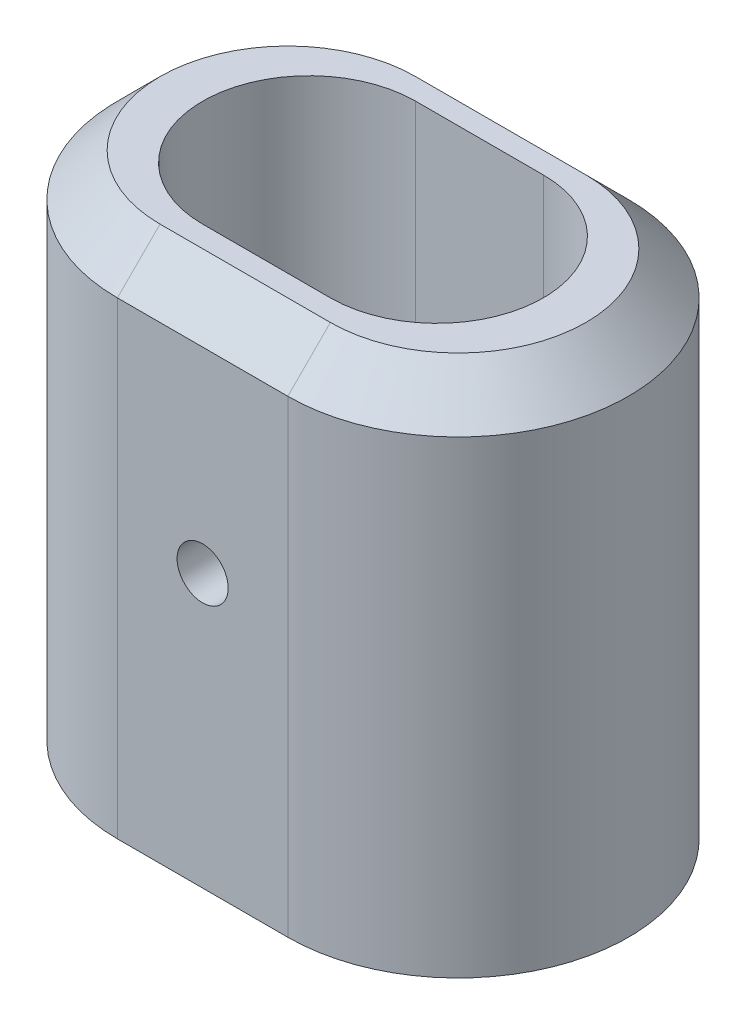
ISO-10303-21;
HEADER;
FILE_DESCRIPTION(('STEP AP214'),'2;1');
FILE_NAME('part.step','',(''),(''),'','','');
FILE_SCHEMA(('AUTOMOTIVE_DESIGN { 1 0 10303 214 1 1 1 1 }'));
ENDSEC;
DATA;
#1=APPLICATION_CONTEXT('core data for automotive mechanical design processes');
#2=APPLICATION_PROTOCOL_DEFINITION('international standard','automotive_design',2000,#1);
#3=PRODUCT_CONTEXT('',#1,'mechanical');
#4=PRODUCT('Part','Part','',(#3));
#5=PRODUCT_RELATED_PRODUCT_CATEGORY('part','',(#4));
#6=PRODUCT_DEFINITION_FORMATION('','',#4);
#7=PRODUCT_DEFINITION_CONTEXT('part definition',#1,'design');
#8=PRODUCT_DEFINITION('design','',#6,#7);
#9=PRODUCT_DEFINITION_SHAPE('','',#8);
#10=(LENGTH_UNIT() NAMED_UNIT(*) SI_UNIT(.MILLI.,.METRE.));
#11=(NAMED_UNIT(*) PLANE_ANGLE_UNIT() SI_UNIT($,.RADIAN.));
#12=(NAMED_UNIT(*) SI_UNIT($,.STERADIAN.) SOLID_ANGLE_UNIT());
#13=UNCERTAINTY_MEASURE_WITH_UNIT(LENGTH_MEASURE(1.E-05),#10,'distance_accuracy_value','');
#14=(GEOMETRIC_REPRESENTATION_CONTEXT(3) GLOBAL_UNCERTAINTY_ASSIGNED_CONTEXT((#13)) GLOBAL_UNIT_ASSIGNED_CONTEXT((#10,
#11,#12)) REPRESENTATION_CONTEXT('',''));
#15=CARTESIAN_POINT('',(0.,0.,0.));
#16=DIRECTION('',(0.,0.,1.));
#17=DIRECTION('',(1.,0.,0.));
#18=AXIS2_PLACEMENT_3D('',#15,#16,#17);
#19=CARTESIAN_POINT('',(-10.,30.,0.));
#20=DIRECTION('',(0.,-1.,0.));
#21=DIRECTION('',(0.,0.,-1.));
#22=AXIS2_PLACEMENT_3D('',#19,#20,#21);
#23=CYLINDRICAL_SURFACE('',#22,20.);
#24=DIRECTION('',(0.,-1.,0.));
#25=VECTOR('',#24,1.);
#26=CARTESIAN_POINT('',(-10.,30.,20.));
#27=LINE('',#26,#25);
#28=CARTESIAN_POINT('',(-10.,25.,20.));
#29=VERTEX_POINT('',#28);
#30=CARTESIAN_POINT('',(-10.,-30.,20.));
#31=VERTEX_POINT('',#30);
#32=EDGE_CURVE('E184',#29,#31,#27,.T.);
#33=ORIENTED_EDGE('',*,*,#32,.F.);
#34=CARTESIAN_POINT('',(-10.,25.,0.));
#35=DIRECTION('',(0.,1.,0.));
#36=DIRECTION('',(0.,0.,1.));
#37=AXIS2_PLACEMENT_3D('',#34,#35,#36);
#38=CIRCLE('',#37,20.);
#39=CARTESIAN_POINT('',(-10.,25.,-20.));
#40=VERTEX_POINT('',#39);
#41=EDGE_CURVE('E198',#29,#40,#38,.F.);
#42=ORIENTED_EDGE('',*,*,#41,.T.);
#43=DIRECTION('',(0.,-1.,0.));
#44=VECTOR('',#43,1.);
#45=CARTESIAN_POINT('',(-10.,30.,-20.));
#46=LINE('',#45,#44);
#47=CARTESIAN_POINT('',(-10.,-30.,-20.));
#48=VERTEX_POINT('',#47);
#49=EDGE_CURVE('E178',#40,#48,#46,.T.);
#50=ORIENTED_EDGE('',*,*,#49,.T.);
#51=CARTESIAN_POINT('',(-10.,-30.,0.));
#52=DIRECTION('',(0.,1.,0.));
#53=DIRECTION('',(0.,0.,1.));
#54=AXIS2_PLACEMENT_3D('',#51,#52,#53);
#55=CIRCLE('',#54,20.);
#56=EDGE_CURVE('E163',#48,#31,#55,.T.);
#57=ORIENTED_EDGE('',*,*,#56,.T.);
#58=EDGE_LOOP('',(#33,#42,#50,#57));
#59=FACE_BOUND('',#58,.T.);
#60=ADVANCED_FACE('F41',(#59),#23,.T.);
#61=CARTESIAN_POINT('',(-10.,30.,20.));
#62=DIRECTION('',(0.,0.,-1.));
#63=DIRECTION('',(-1.,0.,0.));
#64=AXIS2_PLACEMENT_3D('',#61,#62,#63);
#65=PLANE('',#64);
#66=CARTESIAN_POINT('',(0.,2.,20.));
#67=DIRECTION('',(0.,0.,1.));
#68=DIRECTION('',(1.,0.,0.));
#69=AXIS2_PLACEMENT_3D('',#66,#67,#68);
#70=CIRCLE('',#69,3.);
#71=CARTESIAN_POINT('',(3.,2.,20.));
#72=VERTEX_POINT('',#71);
#73=EDGE_CURVE('E382',#72,#72,#70,.T.);
#74=ORIENTED_EDGE('',*,*,#73,.F.);
#75=EDGE_LOOP('',(#74));
#76=FACE_BOUND('',#75,.T.);
#77=DIRECTION('',(0.,-1.,0.));
#78=VECTOR('',#77,1.);
#79=CARTESIAN_POINT('',(10.,30.,20.));
#80=LINE('',#79,#78);
#81=CARTESIAN_POINT('',(10.,25.,20.));
#82=VERTEX_POINT('',#81);
#83=CARTESIAN_POINT('',(10.,-30.,20.));
#84=VERTEX_POINT('',#83);
#85=EDGE_CURVE('E182',#82,#84,#80,.T.);
#86=ORIENTED_EDGE('',*,*,#85,.F.);
#87=DIRECTION('',(-1.,0.,0.));
#88=VECTOR('',#87,1.);
#89=CARTESIAN_POINT('',(-10.,25.,20.));
#90=LINE('',#89,#88);
#91=EDGE_CURVE('E11',#82,#29,#90,.T.);
#92=ORIENTED_EDGE('',*,*,#91,.T.);
#93=ORIENTED_EDGE('',*,*,#32,.T.);
#94=DIRECTION('',(1.,0.,0.));
#95=VECTOR('',#94,1.);
#96=CARTESIAN_POINT('',(-10.,-30.,20.));
#97=LINE('',#96,#95);
#98=EDGE_CURVE('E169',#31,#84,#97,.T.);
#99=ORIENTED_EDGE('',*,*,#98,.T.);
#100=EDGE_LOOP('',(#86,#92,#93,#99));
#101=FACE_BOUND('',#100,.T.);
#102=ADVANCED_FACE('F256',(#76,#101),#65,.F.);
#103=CARTESIAN_POINT('',(10.,30.,0.));
#104=DIRECTION('',(0.,-1.,0.));
#105=DIRECTION('',(0.,0.,-1.));
#106=AXIS2_PLACEMENT_3D('',#103,#104,#105);
#107=CYLINDRICAL_SURFACE('',#106,20.);
#108=DIRECTION('',(0.,-1.,0.));
#109=VECTOR('',#108,1.);
#110=CARTESIAN_POINT('',(9.99999999999999,30.,-20.));
#111=LINE('',#110,#109);
#112=CARTESIAN_POINT('',(9.99999999999999,25.,-20.));
#113=VERTEX_POINT('',#112);
#114=CARTESIAN_POINT('',(9.99999999999999,-30.,-20.));
#115=VERTEX_POINT('',#114);
#116=EDGE_CURVE('E180',#113,#115,#111,.T.);
#117=ORIENTED_EDGE('',*,*,#116,.F.);
#118=CARTESIAN_POINT('',(10.,25.,0.));
#119=DIRECTION('',(0.,1.,0.));
#120=DIRECTION('',(0.,0.,1.));
#121=AXIS2_PLACEMENT_3D('',#118,#119,#120);
#122=CIRCLE('',#121,20.);
#123=EDGE_CURVE('E51',#113,#82,#122,.F.);
#124=ORIENTED_EDGE('',*,*,#123,.T.);
#125=ORIENTED_EDGE('',*,*,#85,.T.);
#126=CARTESIAN_POINT('',(10.,-30.,0.));
#127=DIRECTION('',(0.,1.,0.));
#128=DIRECTION('',(0.,0.,1.));
#129=AXIS2_PLACEMENT_3D('',#126,#127,#128);
#130=CIRCLE('',#129,20.);
#131=EDGE_CURVE('E172',#84,#115,#130,.T.);
#132=ORIENTED_EDGE('',*,*,#131,.T.);
#133=EDGE_LOOP('',(#117,#124,#125,#132));
#134=FACE_BOUND('',#133,.T.);
#135=ADVANCED_FACE('F262',(#134),#107,.T.);
#136=CARTESIAN_POINT('',(-10.,30.,-20.));
#137=DIRECTION('',(0.,0.,1.));
#138=DIRECTION('',(1.,0.,0.));
#139=AXIS2_PLACEMENT_3D('',#136,#137,#138);
#140=PLANE('',#139);
#141=CARTESIAN_POINT('',(0.,2.,-20.));
#142=DIRECTION('',(0.,0.,1.));
#143=DIRECTION('',(1.,0.,0.));
#144=AXIS2_PLACEMENT_3D('',#141,#142,#143);
#145=CIRCLE('',#144,3.);
#146=CARTESIAN_POINT('',(3.,2.,-20.));
#147=VERTEX_POINT('',#146);
#148=EDGE_CURVE('E379',#147,#147,#145,.T.);
#149=ORIENTED_EDGE('',*,*,#148,.T.);
#150=EDGE_LOOP('',(#149));
#151=FACE_BOUND('',#150,.T.);
#152=ORIENTED_EDGE('',*,*,#49,.F.);
#153=DIRECTION('',(1.,0.,0.));
#154=VECTOR('',#153,1.);
#155=CARTESIAN_POINT('',(9.99999999999999,25.,-20.));
#156=LINE('',#155,#154);
#157=EDGE_CURVE('E195',#40,#113,#156,.T.);
#158=ORIENTED_EDGE('',*,*,#157,.T.);
#159=ORIENTED_EDGE('',*,*,#116,.T.);
#160=DIRECTION('',(-1.,0.,0.));
#161=VECTOR('',#160,1.);
#162=CARTESIAN_POINT('',(-10.,-30.,-20.));
#163=LINE('',#162,#161);
#164=EDGE_CURVE('E175',#115,#48,#163,.T.);
#165=ORIENTED_EDGE('',*,*,#164,.T.);
#166=EDGE_LOOP('',(#152,#158,#159,#165));
#167=FACE_BOUND('',#166,.T.);
#168=ADVANCED_FACE('F225',(#151,#167),#140,.F.);
#169=CARTESIAN_POINT('',(-10.,30.,0.));
#170=DIRECTION('',(0.,1.,0.));
#171=DIRECTION('',(0.,0.,1.));
#172=AXIS2_PLACEMENT_3D('',#169,#170,#171);
#173=PLANE('',#172);
#174=CARTESIAN_POINT('',(10.,30.,0.));
#175=DIRECTION('',(0.,1.,0.));
#176=DIRECTION('',(0.,0.,1.));
#177=AXIS2_PLACEMENT_3D('',#174,#175,#176);
#178=CIRCLE('',#177,15.);
#179=CARTESIAN_POINT('',(10.,30.,15.));
#180=VERTEX_POINT('',#179);
#181=CARTESIAN_POINT('',(10.,30.,-15.));
#182=VERTEX_POINT('',#181);
#183=EDGE_CURVE('E188',#180,#182,#178,.T.);
#184=ORIENTED_EDGE('',*,*,#183,.T.);
#185=DIRECTION('',(-1.,0.,0.));
#186=VECTOR('',#185,1.);
#187=CARTESIAN_POINT('',(-10.,30.,-15.));
#188=LINE('',#187,#186);
#189=CARTESIAN_POINT('',(-10.,30.,-15.));
#190=VERTEX_POINT('',#189);
#191=EDGE_CURVE('E192',#182,#190,#188,.T.);
#192=ORIENTED_EDGE('',*,*,#191,.T.);
#193=CARTESIAN_POINT('',(-10.,30.,0.));
#194=DIRECTION('',(0.,1.,0.));
#195=DIRECTION('',(0.,0.,1.));
#196=AXIS2_PLACEMENT_3D('',#193,#194,#195);
#197=CIRCLE('',#196,15.);
#198=CARTESIAN_POINT('',(-10.,30.,15.));
#199=VERTEX_POINT('',#198);
#200=EDGE_CURVE('E190',#190,#199,#197,.T.);
#201=ORIENTED_EDGE('',*,*,#200,.T.);
#202=DIRECTION('',(1.,0.,0.));
#203=VECTOR('',#202,1.);
#204=CARTESIAN_POINT('',(10.,30.,15.));
#205=LINE('',#204,#203);
#206=EDGE_CURVE('E186',#199,#180,#205,.T.);
#207=ORIENTED_EDGE('',*,*,#206,.T.);
#208=EDGE_LOOP('',(#184,#192,#201,#207));
#209=FACE_BOUND('',#208,.T.);
#210=CARTESIAN_POINT('',(-7.5,30.,0.));
#211=DIRECTION('',(0.,1.,0.));
#212=DIRECTION('',(0.,0.,1.));
#213=AXIS2_PLACEMENT_3D('',#210,#211,#212);
#214=CIRCLE('',#213,12.5);
#215=CARTESIAN_POINT('',(-7.5,30.,-12.5));
#216=VERTEX_POINT('',#215);
#217=CARTESIAN_POINT('',(-7.5,30.,12.5));
#218=VERTEX_POINT('',#217);
#219=EDGE_CURVE('E126',#216,#218,#214,.T.);
#220=ORIENTED_EDGE('',*,*,#219,.F.);
#221=DIRECTION('',(-1.,0.,0.));
#222=VECTOR('',#221,1.);
#223=CARTESIAN_POINT('',(-7.5,30.,-12.5));
#224=LINE('',#223,#222);
#225=CARTESIAN_POINT('',(7.5,30.,-12.5));
#226=VERTEX_POINT('',#225);
#227=EDGE_CURVE('E144',#226,#216,#224,.T.);
#228=ORIENTED_EDGE('',*,*,#227,.F.);
#229=CARTESIAN_POINT('',(7.5,30.,0.));
#230=DIRECTION('',(0.,1.,0.));
#231=DIRECTION('',(0.,0.,1.));
#232=AXIS2_PLACEMENT_3D('',#229,#230,#231);
#233=CIRCLE('',#232,12.5);
#234=CARTESIAN_POINT('',(7.50000000000001,30.,12.5));
#235=VERTEX_POINT('',#234);
#236=EDGE_CURVE('E147',#235,#226,#233,.T.);
#237=ORIENTED_EDGE('',*,*,#236,.F.);
#238=DIRECTION('',(1.,0.,0.));
#239=VECTOR('',#238,1.);
#240=CARTESIAN_POINT('',(-7.5,30.,12.5));
#241=LINE('',#240,#239);
#242=EDGE_CURVE('E156',#218,#235,#241,.T.);
#243=ORIENTED_EDGE('',*,*,#242,.F.);
#244=EDGE_LOOP('',(#220,#228,#237,#243));
#245=FACE_BOUND('',#244,.T.);
#246=ADVANCED_FACE('F232',(#209,#245),#173,.T.);
#247=CARTESIAN_POINT('',(-10.,-30.,0.));
#248=DIRECTION('',(0.,1.,0.));
#249=DIRECTION('',(0.,0.,1.));
#250=AXIS2_PLACEMENT_3D('',#247,#248,#249);
#251=PLANE('',#250);
#252=DIRECTION('',(-1.,0.,0.));
#253=VECTOR('',#252,1.);
#254=CARTESIAN_POINT('',(-7.5,-30.,-12.5));
#255=LINE('',#254,#253);
#256=CARTESIAN_POINT('',(7.5,-30.,-12.5));
#257=VERTEX_POINT('',#256);
#258=CARTESIAN_POINT('',(-7.5,-30.,-12.5));
#259=VERTEX_POINT('',#258);
#260=EDGE_CURVE('E131',#257,#259,#255,.T.);
#261=ORIENTED_EDGE('',*,*,#260,.T.);
#262=CARTESIAN_POINT('',(-7.5,-30.,0.));
#263=DIRECTION('',(0.,1.,0.));
#264=DIRECTION('',(0.,0.,1.));
#265=AXIS2_PLACEMENT_3D('',#262,#263,#264);
#266=CIRCLE('',#265,12.5);
#267=CARTESIAN_POINT('',(-7.5,-30.,12.5));
#268=VERTEX_POINT('',#267);
#269=EDGE_CURVE('E123',#259,#268,#266,.T.);
#270=ORIENTED_EDGE('',*,*,#269,.T.);
#271=DIRECTION('',(1.,0.,0.));
#272=VECTOR('',#271,1.);
#273=CARTESIAN_POINT('',(-7.5,-30.,12.5));
#274=LINE('',#273,#272);
#275=CARTESIAN_POINT('',(7.5,-30.,12.5));
#276=VERTEX_POINT('',#275);
#277=EDGE_CURVE('E135',#268,#276,#274,.T.);
#278=ORIENTED_EDGE('',*,*,#277,.T.);
#279=CARTESIAN_POINT('',(7.5,-30.,0.));
#280=DIRECTION('',(0.,1.,0.));
#281=DIRECTION('',(0.,0.,1.));
#282=AXIS2_PLACEMENT_3D('',#279,#280,#281);
#283=CIRCLE('',#282,12.5);
#284=EDGE_CURVE('E139',#276,#257,#283,.T.);
#285=ORIENTED_EDGE('',*,*,#284,.T.);
#286=EDGE_LOOP('',(#261,#270,#278,#285));
#287=FACE_BOUND('',#286,.T.);
#288=ORIENTED_EDGE('',*,*,#56,.F.);
#289=ORIENTED_EDGE('',*,*,#164,.F.);
#290=ORIENTED_EDGE('',*,*,#131,.F.);
#291=ORIENTED_EDGE('',*,*,#98,.F.);
#292=EDGE_LOOP('',(#288,#289,#290,#291));
#293=FACE_BOUND('',#292,.T.);
#294=ADVANCED_FACE('F141',(#287,#293),#251,.F.);
#295=CARTESIAN_POINT('',(-7.5,-30.,0.));
#296=DIRECTION('',(0.,1.,0.));
#297=DIRECTION('',(0.,0.,1.));
#298=AXIS2_PLACEMENT_3D('',#295,#296,#297);
#299=CYLINDRICAL_SURFACE('',#298,12.5);
#300=ORIENTED_EDGE('',*,*,#219,.T.);
#301=DIRECTION('',(0.,1.,0.));
#302=VECTOR('',#301,1.);
#303=CARTESIAN_POINT('',(-7.5,-30.,12.5));
#304=LINE('',#303,#302);
#305=EDGE_CURVE('E119',#268,#218,#304,.T.);
#306=ORIENTED_EDGE('',*,*,#305,.F.);
#307=ORIENTED_EDGE('',*,*,#269,.F.);
#308=DIRECTION('',(0.,1.,0.));
#309=VECTOR('',#308,1.);
#310=CARTESIAN_POINT('',(-7.5,-30.,-12.5));
#311=LINE('',#310,#309);
#312=EDGE_CURVE('E161',#259,#216,#311,.T.);
#313=ORIENTED_EDGE('',*,*,#312,.T.);
#314=EDGE_LOOP('',(#300,#306,#307,#313));
#315=FACE_BOUND('',#314,.T.);
#316=ADVANCED_FACE('F121',(#315),#299,.F.);
#317=CARTESIAN_POINT('',(-7.5,-30.,-12.5));
#318=DIRECTION('',(0.,0.,-1.));
#319=DIRECTION('',(-1.,0.,0.));
#320=AXIS2_PLACEMENT_3D('',#317,#318,#319);
#321=PLANE('',#320);
#322=CARTESIAN_POINT('',(0.,2.,-12.5));
#323=DIRECTION('',(0.,0.,-1.));
#324=DIRECTION('',(-1.,0.,0.));
#325=AXIS2_PLACEMENT_3D('',#322,#323,#324);
#326=CIRCLE('',#325,3.);
#327=CARTESIAN_POINT('',(-3.,2.,-12.5));
#328=VERTEX_POINT('',#327);
#329=EDGE_CURVE('E150',#328,#328,#326,.T.);
#330=ORIENTED_EDGE('',*,*,#329,.T.);
#331=EDGE_LOOP('',(#330));
#332=FACE_BOUND('',#331,.T.);
#333=ORIENTED_EDGE('',*,*,#227,.T.);
#334=ORIENTED_EDGE('',*,*,#312,.F.);
#335=ORIENTED_EDGE('',*,*,#260,.F.);
#336=DIRECTION('',(0.,1.,0.));
#337=VECTOR('',#336,1.);
#338=CARTESIAN_POINT('',(7.5,-30.,-12.5));
#339=LINE('',#338,#337);
#340=EDGE_CURVE('E164',#257,#226,#339,.T.);
#341=ORIENTED_EDGE('',*,*,#340,.T.);
#342=EDGE_LOOP('',(#333,#334,#335,#341));
#343=FACE_BOUND('',#342,.T.);
#344=ADVANCED_FACE('F241',(#332,#343),#321,.F.);
#345=CARTESIAN_POINT('',(7.5,-30.,0.));
#346=DIRECTION('',(0.,1.,0.));
#347=DIRECTION('',(0.,0.,1.));
#348=AXIS2_PLACEMENT_3D('',#345,#346,#347);
#349=CYLINDRICAL_SURFACE('',#348,12.5);
#350=ORIENTED_EDGE('',*,*,#236,.T.);
#351=ORIENTED_EDGE('',*,*,#340,.F.);
#352=ORIENTED_EDGE('',*,*,#284,.F.);
#353=DIRECTION('',(0.,1.,0.));
#354=VECTOR('',#353,1.);
#355=CARTESIAN_POINT('',(7.50000000000001,-30.,12.5));
#356=LINE('',#355,#354);
#357=EDGE_CURVE('E130',#276,#235,#356,.T.);
#358=ORIENTED_EDGE('',*,*,#357,.T.);
#359=EDGE_LOOP('',(#350,#351,#352,#358));
#360=FACE_BOUND('',#359,.T.);
#361=ADVANCED_FACE('F239',(#360),#349,.F.);
#362=CARTESIAN_POINT('',(-7.5,-30.,12.5));
#363=DIRECTION('',(0.,0.,1.));
#364=DIRECTION('',(1.,0.,0.));
#365=AXIS2_PLACEMENT_3D('',#362,#363,#364);
#366=PLANE('',#365);
#367=CARTESIAN_POINT('',(0.,2.,12.5));
#368=DIRECTION('',(0.,0.,1.));
#369=DIRECTION('',(1.,0.,0.));
#370=AXIS2_PLACEMENT_3D('',#367,#368,#369);
#371=CIRCLE('',#370,3.);
#372=CARTESIAN_POINT('',(3.,2.,12.5));
#373=VERTEX_POINT('',#372);
#374=EDGE_CURVE('E46',#373,#373,#371,.T.);
#375=ORIENTED_EDGE('',*,*,#374,.T.);
#376=EDGE_LOOP('',(#375));
#377=FACE_BOUND('',#376,.T.);
#378=ORIENTED_EDGE('',*,*,#242,.T.);
#379=ORIENTED_EDGE('',*,*,#357,.F.);
#380=ORIENTED_EDGE('',*,*,#277,.F.);
#381=ORIENTED_EDGE('',*,*,#305,.T.);
#382=EDGE_LOOP('',(#378,#379,#380,#381));
#383=FACE_BOUND('',#382,.T.);
#384=ADVANCED_FACE('F136',(#377,#383),#366,.F.);
#385=CARTESIAN_POINT('',(-10.,30.,15.));
#386=DIRECTION('',(0.,0.707106781186545,0.70710678118655));
#387=DIRECTION('',(-1.,0.,0.));
#388=AXIS2_PLACEMENT_3D('',#385,#386,#387);
#389=PLANE('',#388);
#390=DIRECTION('',(0.,0.70710678118655,-0.707106781186545));
#391=VECTOR('',#390,1.);
#392=CARTESIAN_POINT('',(-10.,25.,20.));
#393=LINE('',#392,#391);
#394=EDGE_CURVE('E205',#29,#199,#393,.T.);
#395=ORIENTED_EDGE('',*,*,#394,.F.);
#396=ORIENTED_EDGE('',*,*,#91,.F.);
#397=DIRECTION('',(0.,-0.70710678118655,0.707106781186545));
#398=VECTOR('',#397,1.);
#399=CARTESIAN_POINT('',(10.,30.,15.));
#400=LINE('',#399,#398);
#401=EDGE_CURVE('E157',#180,#82,#400,.T.);
#402=ORIENTED_EDGE('',*,*,#401,.F.);
#403=ORIENTED_EDGE('',*,*,#206,.F.);
#404=EDGE_LOOP('',(#395,#396,#402,#403));
#405=FACE_BOUND('',#404,.T.);
#406=ADVANCED_FACE('F44',(#405),#389,.T.);
#407=CARTESIAN_POINT('',(10.,30.,0.));
#408=DIRECTION('',(0.,-1.,0.));
#409=DIRECTION('',(0.,0.,-1.));
#410=AXIS2_PLACEMENT_3D('',#407,#408,#409);
#411=CONICAL_SURFACE('',#410,15.,0.785398163397446);
#412=ORIENTED_EDGE('',*,*,#401,.T.);
#413=ORIENTED_EDGE('',*,*,#123,.F.);
#414=DIRECTION('',(0.,-0.707106781186549,-0.707106781186545));
#415=VECTOR('',#414,1.);
#416=CARTESIAN_POINT('',(10.,30.,-15.));
#417=LINE('',#416,#415);
#418=EDGE_CURVE('E203',#182,#113,#417,.T.);
#419=ORIENTED_EDGE('',*,*,#418,.F.);
#420=ORIENTED_EDGE('',*,*,#183,.F.);
#421=EDGE_LOOP('',(#412,#413,#419,#420));
#422=FACE_BOUND('',#421,.T.);
#423=ADVANCED_FACE('F211',(#422),#411,.T.);
#424=CARTESIAN_POINT('',(-10.,30.,0.));
#425=DIRECTION('',(0.,-1.,0.));
#426=DIRECTION('',(0.,0.,-1.));
#427=AXIS2_PLACEMENT_3D('',#424,#425,#426);
#428=CONICAL_SURFACE('',#427,15.,0.785398163397446);
#429=ORIENTED_EDGE('',*,*,#394,.T.);
#430=ORIENTED_EDGE('',*,*,#200,.F.);
#431=DIRECTION('',(0.,0.707106781186549,0.707106781186545));
#432=VECTOR('',#431,1.);
#433=CARTESIAN_POINT('',(-10.,25.,-20.));
#434=LINE('',#433,#432);
#435=EDGE_CURVE('E201',#40,#190,#434,.T.);
#436=ORIENTED_EDGE('',*,*,#435,.F.);
#437=ORIENTED_EDGE('',*,*,#41,.F.);
#438=EDGE_LOOP('',(#429,#430,#436,#437));
#439=FACE_BOUND('',#438,.T.);
#440=ADVANCED_FACE('F220',(#439),#428,.T.);
#441=CARTESIAN_POINT('',(-10.,30.,-15.));
#442=DIRECTION('',(0.,0.707106781186545,-0.70710678118655));
#443=DIRECTION('',(1.,0.,0.));
#444=AXIS2_PLACEMENT_3D('',#441,#442,#443);
#445=PLANE('',#444);
#446=ORIENTED_EDGE('',*,*,#418,.T.);
#447=ORIENTED_EDGE('',*,*,#157,.F.);
#448=ORIENTED_EDGE('',*,*,#435,.T.);
#449=ORIENTED_EDGE('',*,*,#191,.F.);
#450=EDGE_LOOP('',(#446,#447,#448,#449));
#451=FACE_BOUND('',#450,.T.);
#452=ADVANCED_FACE('F229',(#451),#445,.T.);
#453=CARTESIAN_POINT('',(0.,2.,-20.));
#454=DIRECTION('',(0.,0.,1.));
#455=DIRECTION('',(1.,0.,0.));
#456=AXIS2_PLACEMENT_3D('',#453,#454,#455);
#457=CYLINDRICAL_SURFACE('',#456,3.);
#458=ORIENTED_EDGE('',*,*,#73,.T.);
#459=EDGE_LOOP('',(#458));
#460=FACE_BOUND('',#459,.T.);
#461=ORIENTED_EDGE('',*,*,#374,.F.);
#462=EDGE_LOOP('',(#461));
#463=FACE_BOUND('',#462,.T.);
#464=ADVANCED_FACE('F273',(#460,#463),#457,.F.);
#465=ORIENTED_EDGE('',*,*,#148,.F.);
#466=EDGE_LOOP('',(#465));
#467=FACE_BOUND('',#466,.T.);
#468=ORIENTED_EDGE('',*,*,#329,.F.);
#469=EDGE_LOOP('',(#468));
#470=FACE_BOUND('',#469,.T.);
#471=ADVANCED_FACE('F365',(#467,#470),#457,.F.);
#472=CLOSED_SHELL('',(#60,#102,#135,#168,#246,#294,#316,#344,#361,#384,#406,#423,#440,#452,#464,#471));
#473=MANIFOLD_SOLID_BREP('B2',#472);
#474=ADVANCED_BREP_SHAPE_REPRESENTATION('',(#18,#473),#14);
#475=SHAPE_DEFINITION_REPRESENTATION(#9,#474);
ENDSEC;
END-ISO-10303-21;
